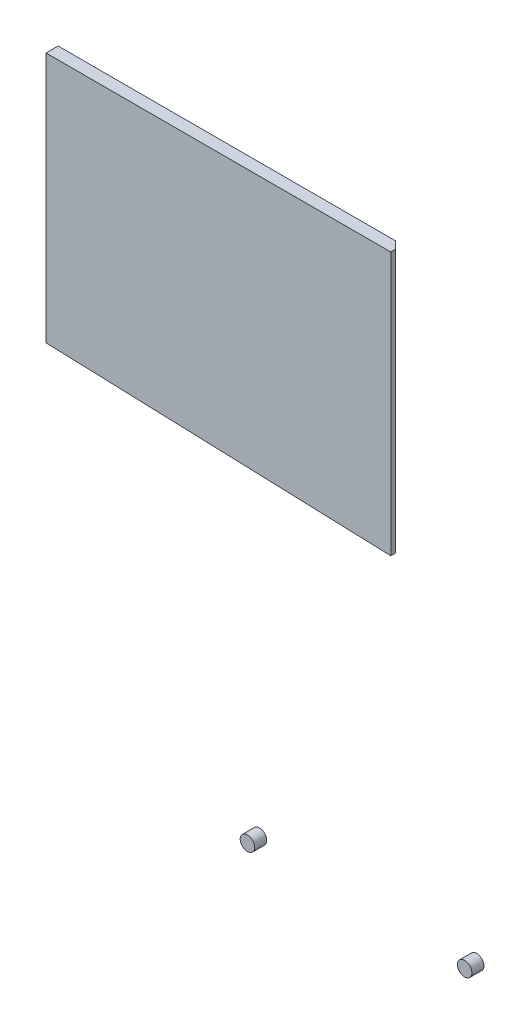
ISO-10303-21;
HEADER;
FILE_DESCRIPTION(('STEP AP214'),'2;1');
FILE_NAME('part.step','',(''),(''),'','','');
FILE_SCHEMA(('AUTOMOTIVE_DESIGN { 1 0 10303 214 1 1 1 1 }'));
ENDSEC;
DATA;
#1=APPLICATION_CONTEXT('core data for automotive mechanical design processes');
#2=APPLICATION_PROTOCOL_DEFINITION('international standard','automotive_design',2000,#1);
#3=PRODUCT_CONTEXT('',#1,'mechanical');
#4=PRODUCT('Part','Part','',(#3));
#5=PRODUCT_RELATED_PRODUCT_CATEGORY('part','',(#4));
#6=PRODUCT_DEFINITION_FORMATION('','',#4);
#7=PRODUCT_DEFINITION_CONTEXT('part definition',#1,'design');
#8=PRODUCT_DEFINITION('design','',#6,#7);
#9=PRODUCT_DEFINITION_SHAPE('','',#8);
#10=(LENGTH_UNIT() NAMED_UNIT(*) SI_UNIT(.MILLI.,.METRE.));
#11=(NAMED_UNIT(*) PLANE_ANGLE_UNIT() SI_UNIT($,.RADIAN.));
#12=(NAMED_UNIT(*) SI_UNIT($,.STERADIAN.) SOLID_ANGLE_UNIT());
#13=UNCERTAINTY_MEASURE_WITH_UNIT(LENGTH_MEASURE(1.E-05),#10,'distance_accuracy_value','');
#14=(GEOMETRIC_REPRESENTATION_CONTEXT(3) GLOBAL_UNCERTAINTY_ASSIGNED_CONTEXT((#13)) GLOBAL_UNIT_ASSIGNED_CONTEXT((#10,
#11,#12)) REPRESENTATION_CONTEXT('',''));
#15=CARTESIAN_POINT('',(0.,0.,0.));
#16=DIRECTION('',(0.,0.,1.));
#17=DIRECTION('',(1.,0.,0.));
#18=AXIS2_PLACEMENT_3D('',#15,#16,#17);
#19=CARTESIAN_POINT('',(27.1478852145001,-9.14131648071703,201.989431099549));
#20=DIRECTION('',(0.0350064436594107,0.999387086619754,0.));
#21=DIRECTION('',(-0.999387086619755,0.0350064436594107,0.));
#22=AXIS2_PLACEMENT_3D('',#19,#20,#21);
#23=PLANE('',#22);
#24=DIRECTION('',(-0.999387086619754,0.0350064436594107,0.));
#25=VECTOR('',#24,1.);
#26=CARTESIAN_POINT('',(27.1478852145001,-9.14131648071703,201.989431099549));
#27=LINE('',#26,#25);
#28=CARTESIAN_POINT('',(24.1478852145,-9.0362327425096,201.989431099549));
#29=VERTEX_POINT('',#28);
#30=CARTESIAN_POINT('',(-115.676736197404,-4.13846810537597,201.98943109955));
#31=VERTEX_POINT('',#30);
#32=EDGE_CURVE('E86',#29,#31,#27,.T.);
#33=ORIENTED_EDGE('',*,*,#32,.F.);
#34=DIRECTION('',(0.706889983939646,-0.0247608806712726,0.706889983939643));
#35=VECTOR('',#34,1.);
#36=CARTESIAN_POINT('',(23.9897220580293,-9.03069261726672,201.831267943079));
#37=LINE('',#36,#35);
#38=CARTESIAN_POINT('',(27.1478852145001,-9.1413164807171,204.989431099549));
#39=VERTEX_POINT('',#38);
#40=EDGE_CURVE('E64',#29,#39,#37,.T.);
#41=ORIENTED_EDGE('',*,*,#40,.T.);
#42=DIRECTION('',(0.,0.,1.));
#43=VECTOR('',#42,1.);
#44=CARTESIAN_POINT('',(27.1478852145001,-9.14131648071703,201.989431099549));
#45=LINE('',#44,#43);
#46=CARTESIAN_POINT('',(27.1478852145001,-9.14131648071715,206.989431099549));
#47=VERTEX_POINT('',#46);
#48=EDGE_CURVE('E116',#39,#47,#45,.T.);
#49=ORIENTED_EDGE('',*,*,#48,.T.);
#50=DIRECTION('',(-0.999387086619754,0.0350064436594107,0.));
#51=VECTOR('',#50,1.);
#52=CARTESIAN_POINT('',(27.1478852145001,-9.14131648071715,206.989431099549));
#53=LINE('',#52,#51);
#54=CARTESIAN_POINT('',(-115.676736197404,-4.13846810537609,206.98943109955));
#55=VERTEX_POINT('',#54);
#56=EDGE_CURVE('E108',#47,#55,#53,.T.);
#57=ORIENTED_EDGE('',*,*,#56,.T.);
#58=DIRECTION('',(0.,0.,1.));
#59=VECTOR('',#58,1.);
#60=CARTESIAN_POINT('',(-115.676736197404,-4.13846810537597,201.98943109955));
#61=LINE('',#60,#59);
#62=EDGE_CURVE('E100',#31,#55,#61,.T.);
#63=ORIENTED_EDGE('',*,*,#62,.F.);
#64=EDGE_LOOP('',(#33,#41,#49,#57,#63));
#65=FACE_BOUND('',#64,.T.);
#66=ADVANCED_FACE('F42',(#65),#23,.F.);
#67=CARTESIAN_POINT('',(-115.676736197404,-4.13846810537597,201.98943109955));
#68=DIRECTION('',(1.,0.,0.));
#69=DIRECTION('',(0.,1.,0.));
#70=AXIS2_PLACEMENT_3D('',#67,#68,#69);
#71=PLANE('',#70);
#72=DIRECTION('',(0.,1.,0.));
#73=VECTOR('',#72,1.);
#74=CARTESIAN_POINT('',(-115.676736197404,-4.13846810537609,206.98943109955));
#75=LINE('',#74,#73);
#76=CARTESIAN_POINT('',(-115.676736197401,99.858683519277,206.989431099552));
#77=VERTEX_POINT('',#76);
#78=EDGE_CURVE('E123',#55,#77,#75,.T.);
#79=ORIENTED_EDGE('',*,*,#78,.T.);
#80=DIRECTION('',(0.,0.,1.));
#81=VECTOR('',#80,1.);
#82=CARTESIAN_POINT('',(-115.676736197401,99.8586835192771,201.989431099552));
#83=LINE('',#82,#81);
#84=CARTESIAN_POINT('',(-115.676736197401,99.8586835192771,201.989431099552));
#85=VERTEX_POINT('',#84);
#86=EDGE_CURVE('E103',#85,#77,#83,.T.);
#87=ORIENTED_EDGE('',*,*,#86,.F.);
#88=DIRECTION('',(0.,1.,0.));
#89=VECTOR('',#88,1.);
#90=CARTESIAN_POINT('',(-115.676736197404,-4.13846810537597,201.98943109955));
#91=LINE('',#90,#89);
#92=EDGE_CURVE('E90',#31,#85,#91,.T.);
#93=ORIENTED_EDGE('',*,*,#92,.F.);
#94=ORIENTED_EDGE('',*,*,#62,.T.);
#95=EDGE_LOOP('',(#79,#87,#93,#94));
#96=FACE_BOUND('',#95,.T.);
#97=ADVANCED_FACE('F99',(#96),#71,.F.);
#98=CARTESIAN_POINT('',(27.1478852145001,99.8586835192828,201.989431099552));
#99=DIRECTION('',(0.,-1.,0.));
#100=DIRECTION('',(1.,0.,0.));
#101=AXIS2_PLACEMENT_3D('',#98,#99,#100);
#102=PLANE('',#101);
#103=DIRECTION('',(0.,0.,1.));
#104=VECTOR('',#103,1.);
#105=CARTESIAN_POINT('',(27.1478852145001,99.8586835192828,201.989431099552));
#106=LINE('',#105,#104);
#107=CARTESIAN_POINT('',(27.1478852145001,99.8586835192828,204.989431099552));
#108=VERTEX_POINT('',#107);
#109=CARTESIAN_POINT('',(27.1478852145001,99.8586835192827,206.989431099552));
#110=VERTEX_POINT('',#109);
#111=EDGE_CURVE('E111',#108,#110,#106,.T.);
#112=ORIENTED_EDGE('',*,*,#111,.F.);
#113=DIRECTION('',(-0.707106781186549,0.,-0.707106781186546));
#114=VECTOR('',#113,1.);
#115=CARTESIAN_POINT('',(24.147885214498,99.8586835192827,201.98943109955));
#116=LINE('',#115,#114);
#117=CARTESIAN_POINT('',(24.1478852145,99.8586835192827,201.989431099552));
#118=VERTEX_POINT('',#117);
#119=EDGE_CURVE('E12',#108,#118,#116,.T.);
#120=ORIENTED_EDGE('',*,*,#119,.T.);
#121=DIRECTION('',(1.,0.,0.));
#122=VECTOR('',#121,1.);
#123=CARTESIAN_POINT('',(27.1478852145001,99.8586835192828,201.989431099552));
#124=LINE('',#123,#122);
#125=EDGE_CURVE('E105',#85,#118,#124,.T.);
#126=ORIENTED_EDGE('',*,*,#125,.F.);
#127=ORIENTED_EDGE('',*,*,#86,.T.);
#128=DIRECTION('',(1.,0.,0.));
#129=VECTOR('',#128,1.);
#130=CARTESIAN_POINT('',(27.1478852145001,99.8586835192827,206.989431099552));
#131=LINE('',#130,#129);
#132=EDGE_CURVE('E120',#77,#110,#131,.T.);
#133=ORIENTED_EDGE('',*,*,#132,.T.);
#134=EDGE_LOOP('',(#112,#120,#126,#127,#133));
#135=FACE_BOUND('',#134,.T.);
#136=ADVANCED_FACE('F129',(#135),#102,.F.);
#137=CARTESIAN_POINT('',(27.1478852145001,99.8586835192828,201.989431099552));
#138=DIRECTION('',(-1.,0.,0.));
#139=DIRECTION('',(0.,-1.,0.));
#140=AXIS2_PLACEMENT_3D('',#137,#138,#139);
#141=PLANE('',#140);
#142=ORIENTED_EDGE('',*,*,#48,.F.);
#143=DIRECTION('',(0.,1.,0.));
#144=VECTOR('',#143,1.);
#145=CARTESIAN_POINT('',(27.1478852145001,99.8586835192827,204.989431099552));
#146=LINE('',#145,#144);
#147=EDGE_CURVE('E50',#39,#108,#146,.T.);
#148=ORIENTED_EDGE('',*,*,#147,.T.);
#149=ORIENTED_EDGE('',*,*,#111,.T.);
#150=DIRECTION('',(0.,-1.,0.));
#151=VECTOR('',#150,1.);
#152=CARTESIAN_POINT('',(27.1478852145001,99.8586835192827,206.989431099552));
#153=LINE('',#152,#151);
#154=EDGE_CURVE('E95',#110,#47,#153,.T.);
#155=ORIENTED_EDGE('',*,*,#154,.T.);
#156=EDGE_LOOP('',(#142,#148,#149,#155));
#157=FACE_BOUND('',#156,.T.);
#158=ADVANCED_FACE('F132',(#157),#141,.F.);
#159=CARTESIAN_POINT('',(0.,-5.01340726743936E-12,201.98943109955));
#160=DIRECTION('',(0.,0.,-1.));
#161=DIRECTION('',(0.,1.,0.));
#162=AXIS2_PLACEMENT_3D('',#159,#160,#161);
#163=PLANE('',#162);
#164=ORIENTED_EDGE('',*,*,#125,.T.);
#165=DIRECTION('',(0.,-1.,0.));
#166=VECTOR('',#165,1.);
#167=CARTESIAN_POINT('',(24.1478852145,-9.14131648071702,201.989431099549));
#168=LINE('',#167,#166);
#169=EDGE_CURVE('E93',#118,#29,#168,.T.);
#170=ORIENTED_EDGE('',*,*,#169,.T.);
#171=ORIENTED_EDGE('',*,*,#32,.T.);
#172=ORIENTED_EDGE('',*,*,#92,.T.);
#173=EDGE_LOOP('',(#164,#170,#171,#172));
#174=FACE_BOUND('',#173,.T.);
#175=ADVANCED_FACE('F89',(#174),#163,.T.);
#176=CARTESIAN_POINT('',(0.,-5.13759556545067E-12,206.98943109955));
#177=DIRECTION('',(0.,0.,-1.));
#178=DIRECTION('',(0.,1.,0.));
#179=AXIS2_PLACEMENT_3D('',#176,#177,#178);
#180=PLANE('',#179);
#181=ORIENTED_EDGE('',*,*,#56,.F.);
#182=ORIENTED_EDGE('',*,*,#154,.F.);
#183=ORIENTED_EDGE('',*,*,#132,.F.);
#184=ORIENTED_EDGE('',*,*,#78,.F.);
#185=EDGE_LOOP('',(#181,#182,#183,#184));
#186=FACE_BOUND('',#185,.T.);
#187=ADVANCED_FACE('F134',(#186),#180,.F.);
#188=CARTESIAN_POINT('',(24.1478852145,-5.01648175576059E-12,201.98943109955));
#189=DIRECTION('',(0.707106781186546,0.,-0.707106781186549));
#190=DIRECTION('',(0.,1.,0.));
#191=AXIS2_PLACEMENT_3D('',#188,#189,#190);
#192=PLANE('',#191);
#193=ORIENTED_EDGE('',*,*,#119,.F.);
#194=ORIENTED_EDGE('',*,*,#147,.F.);
#195=ORIENTED_EDGE('',*,*,#40,.F.);
#196=ORIENTED_EDGE('',*,*,#169,.F.);
#197=EDGE_LOOP('',(#193,#194,#195,#196));
#198=FACE_BOUND('',#197,.T.);
#199=ADVANCED_FACE('F44',(#198),#192,.T.);
#200=CLOSED_SHELL('',(#66,#97,#136,#158,#175,#187,#199));
#201=MANIFOLD_SOLID_BREP('B2',#200);
#202=CARTESIAN_POINT('',(57.7651375385902,-141.965937892633,201.989431099546));
#203=DIRECTION('',(0.,0.,1.));
#204=DIRECTION('',(0.,-1.,0.));
#205=AXIS2_PLACEMENT_3D('',#202,#203,#204);
#206=CYLINDRICAL_SURFACE('',#205,3.00000000000001);
#207=CARTESIAN_POINT('',(57.7651375385902,-141.965937892633,201.989431099546));
#208=DIRECTION('',(0.,0.,-1.));
#209=DIRECTION('',(0.,1.,0.));
#210=AXIS2_PLACEMENT_3D('',#207,#208,#209);
#211=CIRCLE('',#210,3.00000000000001);
#212=CARTESIAN_POINT('',(57.7651375385902,-138.965937892633,201.989431099546));
#213=VERTEX_POINT('',#212);
#214=EDGE_CURVE('E41',#213,#213,#211,.T.);
#215=ORIENTED_EDGE('',*,*,#214,.F.);
#216=EDGE_LOOP('',(#215));
#217=FACE_BOUND('',#216,.T.);
#218=CARTESIAN_POINT('',(57.7651375385902,-141.965937892633,206.989431099546));
#219=DIRECTION('',(0.,0.,-1.));
#220=DIRECTION('',(0.,1.,0.));
#221=AXIS2_PLACEMENT_3D('',#218,#219,#220);
#222=CIRCLE('',#221,3.00000000000001);
#223=CARTESIAN_POINT('',(57.7651375385902,-138.965937892633,206.989431099546));
#224=VERTEX_POINT('',#223);
#225=EDGE_CURVE('E202',#224,#224,#222,.T.);
#226=ORIENTED_EDGE('',*,*,#225,.T.);
#227=EDGE_LOOP('',(#226));
#228=FACE_BOUND('',#227,.T.);
#229=ADVANCED_FACE('F199',(#217,#228),#206,.T.);
#230=CARTESIAN_POINT('',(57.7651375385902,-141.965937892633,201.989431099546));
#231=DIRECTION('',(0.,0.,-1.));
#232=DIRECTION('',(0.,1.,0.));
#233=AXIS2_PLACEMENT_3D('',#230,#231,#232);
#234=PLANE('',#233);
#235=ORIENTED_EDGE('',*,*,#214,.T.);
#236=EDGE_LOOP('',(#235));
#237=FACE_BOUND('',#236,.T.);
#238=ADVANCED_FACE('F214',(#237),#234,.T.);
#239=CARTESIAN_POINT('',(57.7651375385902,-141.965937892633,206.989431099546));
#240=DIRECTION('',(0.,0.,-1.));
#241=DIRECTION('',(0.,1.,0.));
#242=AXIS2_PLACEMENT_3D('',#239,#240,#241);
#243=PLANE('',#242);
#244=ORIENTED_EDGE('',*,*,#225,.F.);
#245=EDGE_LOOP('',(#244));
#246=FACE_BOUND('',#245,.T.);
#247=ADVANCED_FACE('F212',(#246),#243,.F.);
#248=CLOSED_SHELL('',(#229,#238,#247));
#249=MANIFOLD_SOLID_BREP('B6',#248);
#250=CARTESIAN_POINT('',(-32.2348624614098,-141.965937892633,201.989431099546));
#251=DIRECTION('',(0.,0.,1.));
#252=DIRECTION('',(0.,-1.,0.));
#253=AXIS2_PLACEMENT_3D('',#250,#251,#252);
#254=CYLINDRICAL_SURFACE('',#253,3.00000000000002);
#255=CARTESIAN_POINT('',(-32.2348624614098,-141.965937892633,201.989431099546));
#256=DIRECTION('',(0.,0.,-1.));
#257=DIRECTION('',(0.,1.,0.));
#258=AXIS2_PLACEMENT_3D('',#255,#256,#257);
#259=CIRCLE('',#258,3.00000000000002);
#260=CARTESIAN_POINT('',(-32.2348624614098,-138.965937892633,201.989431099546));
#261=VERTEX_POINT('',#260);
#262=EDGE_CURVE('E198',#261,#261,#259,.T.);
#263=ORIENTED_EDGE('',*,*,#262,.F.);
#264=EDGE_LOOP('',(#263));
#265=FACE_BOUND('',#264,.T.);
#266=CARTESIAN_POINT('',(-32.2348624614098,-141.965937892633,206.989431099546));
#267=DIRECTION('',(0.,0.,-1.));
#268=DIRECTION('',(0.,1.,0.));
#269=AXIS2_PLACEMENT_3D('',#266,#267,#268);
#270=CIRCLE('',#269,3.00000000000002);
#271=CARTESIAN_POINT('',(-32.2348624614098,-138.965937892633,206.989431099546));
#272=VERTEX_POINT('',#271);
#273=EDGE_CURVE('E243',#272,#272,#270,.T.);
#274=ORIENTED_EDGE('',*,*,#273,.T.);
#275=EDGE_LOOP('',(#274));
#276=FACE_BOUND('',#275,.T.);
#277=ADVANCED_FACE('F240',(#265,#276),#254,.T.);
#278=CARTESIAN_POINT('',(-32.2348624614098,-141.965937892633,201.989431099546));
#279=DIRECTION('',(0.,0.,-1.));
#280=DIRECTION('',(0.,1.,0.));
#281=AXIS2_PLACEMENT_3D('',#278,#279,#280);
#282=PLANE('',#281);
#283=ORIENTED_EDGE('',*,*,#262,.T.);
#284=EDGE_LOOP('',(#283));
#285=FACE_BOUND('',#284,.T.);
#286=ADVANCED_FACE('F255',(#285),#282,.T.);
#287=CARTESIAN_POINT('',(-32.2348624614098,-141.965937892633,206.989431099546));
#288=DIRECTION('',(0.,0.,-1.));
#289=DIRECTION('',(0.,1.,0.));
#290=AXIS2_PLACEMENT_3D('',#287,#288,#289);
#291=PLANE('',#290);
#292=ORIENTED_EDGE('',*,*,#273,.F.);
#293=EDGE_LOOP('',(#292));
#294=FACE_BOUND('',#293,.T.);
#295=ADVANCED_FACE('F253',(#294),#291,.F.);
#296=CLOSED_SHELL('',(#277,#286,#295));
#297=MANIFOLD_SOLID_BREP('B36',#296);
#298=ADVANCED_BREP_SHAPE_REPRESENTATION('',(#18,#201,#249,#297),#14);
#299=SHAPE_DEFINITION_REPRESENTATION(#9,#298);
ENDSEC;
END-ISO-10303-21;
